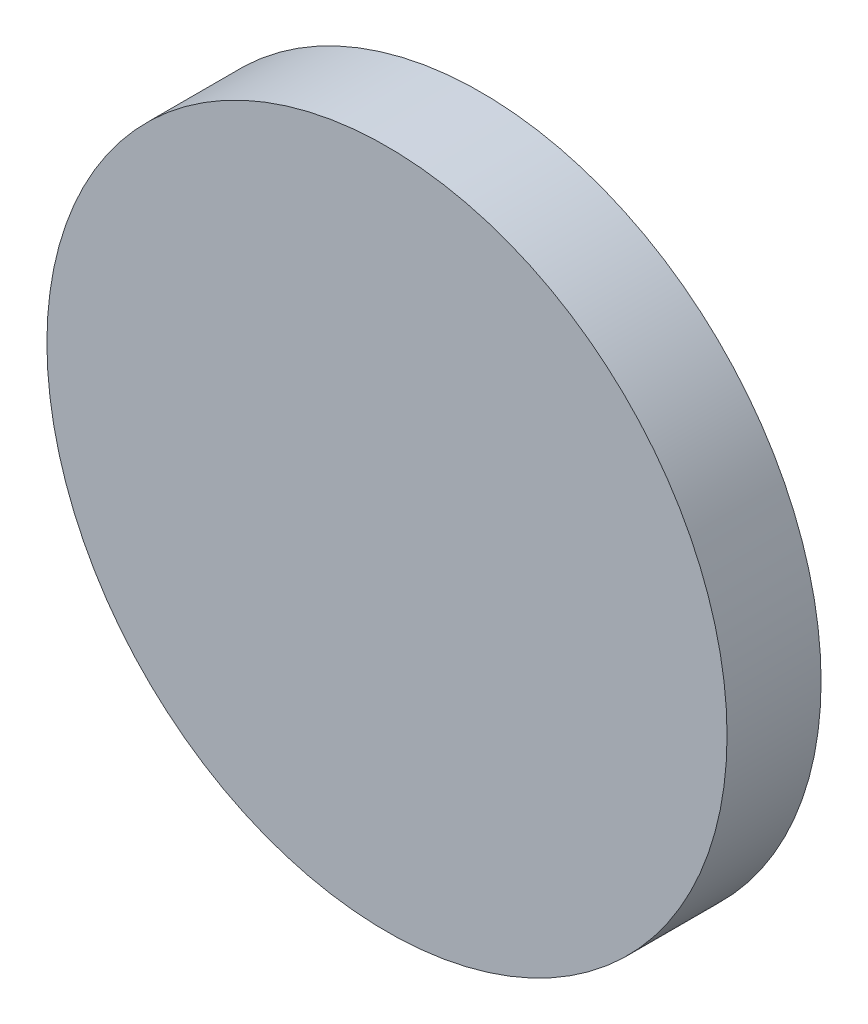
ISO-10303-21;
HEADER;
FILE_DESCRIPTION(('STEP AP214'),'2;1');
FILE_NAME('part.step','',(''),(''),'','','');
FILE_SCHEMA(('AUTOMOTIVE_DESIGN { 1 0 10303 214 1 1 1 1 }'));
ENDSEC;
DATA;
#1=APPLICATION_CONTEXT('core data for automotive mechanical design processes');
#2=APPLICATION_PROTOCOL_DEFINITION('international standard','automotive_design',2000,#1);
#3=PRODUCT_CONTEXT('',#1,'mechanical');
#4=PRODUCT('Part','Part','',(#3));
#5=PRODUCT_RELATED_PRODUCT_CATEGORY('part','',(#4));
#6=PRODUCT_DEFINITION_FORMATION('','',#4);
#7=PRODUCT_DEFINITION_CONTEXT('part definition',#1,'design');
#8=PRODUCT_DEFINITION('design','',#6,#7);
#9=PRODUCT_DEFINITION_SHAPE('','',#8);
#10=(LENGTH_UNIT() NAMED_UNIT(*) SI_UNIT(.MILLI.,.METRE.));
#11=(NAMED_UNIT(*) PLANE_ANGLE_UNIT() SI_UNIT($,.RADIAN.));
#12=(NAMED_UNIT(*) SI_UNIT($,.STERADIAN.) SOLID_ANGLE_UNIT());
#13=UNCERTAINTY_MEASURE_WITH_UNIT(LENGTH_MEASURE(1.E-05),#10,'distance_accuracy_value','');
#14=(GEOMETRIC_REPRESENTATION_CONTEXT(3) GLOBAL_UNCERTAINTY_ASSIGNED_CONTEXT((#13)) GLOBAL_UNIT_ASSIGNED_CONTEXT((#10,
#11,#12)) REPRESENTATION_CONTEXT('',''));
#15=CARTESIAN_POINT('',(0.,0.,0.));
#16=DIRECTION('',(0.,0.,1.));
#17=DIRECTION('',(1.,0.,0.));
#18=AXIS2_PLACEMENT_3D('',#15,#16,#17);
#19=CARTESIAN_POINT('',(0.,0.,3.));
#20=DIRECTION('',(0.,0.,-1.));
#21=DIRECTION('',(-1.,0.,0.));
#22=AXIS2_PLACEMENT_3D('',#19,#20,#21);
#23=CYLINDRICAL_SURFACE('',#22,10.85);
#24=CARTESIAN_POINT('',(0.,0.,3.));
#25=DIRECTION('',(0.,0.,1.));
#26=DIRECTION('',(1.,0.,0.));
#27=AXIS2_PLACEMENT_3D('',#24,#25,#26);
#28=CIRCLE('',#27,10.85);
#29=CARTESIAN_POINT('',(10.85,0.,3.));
#30=VERTEX_POINT('',#29);
#31=EDGE_CURVE('E10',#30,#30,#28,.T.);
#32=ORIENTED_EDGE('',*,*,#31,.F.);
#33=EDGE_LOOP('',(#32));
#34=FACE_BOUND('',#33,.T.);
#35=CARTESIAN_POINT('',(0.,0.,0.));
#36=DIRECTION('',(0.,0.,1.));
#37=DIRECTION('',(1.,0.,0.));
#38=AXIS2_PLACEMENT_3D('',#35,#36,#37);
#39=CIRCLE('',#38,10.85);
#40=CARTESIAN_POINT('',(10.85,0.,0.));
#41=VERTEX_POINT('',#40);
#42=EDGE_CURVE('E46',#41,#41,#39,.T.);
#43=ORIENTED_EDGE('',*,*,#42,.T.);
#44=EDGE_LOOP('',(#43));
#45=FACE_BOUND('',#44,.T.);
#46=ADVANCED_FACE('F43',(#34,#45),#23,.T.);
#47=CARTESIAN_POINT('',(0.,0.,3.));
#48=DIRECTION('',(0.,0.,1.));
#49=DIRECTION('',(1.,0.,0.));
#50=AXIS2_PLACEMENT_3D('',#47,#48,#49);
#51=PLANE('',#50);
#52=ORIENTED_EDGE('',*,*,#31,.T.);
#53=EDGE_LOOP('',(#52));
#54=FACE_BOUND('',#53,.T.);
#55=ADVANCED_FACE('F60',(#54),#51,.T.);
#56=CARTESIAN_POINT('',(0.,0.,0.));
#57=DIRECTION('',(0.,0.,1.));
#58=DIRECTION('',(1.,0.,0.));
#59=AXIS2_PLACEMENT_3D('',#56,#57,#58);
#60=PLANE('',#59);
#61=ORIENTED_EDGE('',*,*,#42,.F.);
#62=EDGE_LOOP('',(#61));
#63=FACE_BOUND('',#62,.T.);
#64=ADVANCED_FACE('F58',(#63),#60,.F.);
#65=CLOSED_SHELL('',(#46,#55,#64));
#66=MANIFOLD_SOLID_BREP('B2',#65);
#67=ADVANCED_BREP_SHAPE_REPRESENTATION('',(#18,#66),#14);
#68=SHAPE_DEFINITION_REPRESENTATION(#9,#67);
ENDSEC;
END-ISO-10303-21;
